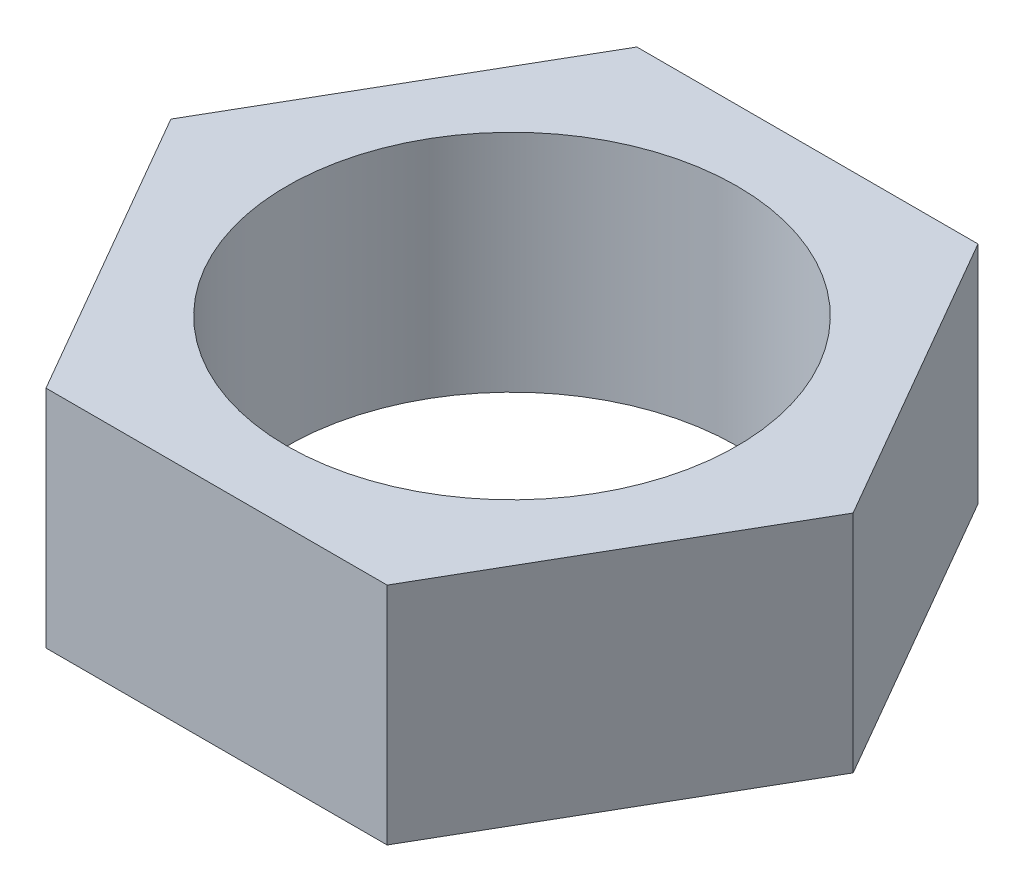
ISO-10303-21;
HEADER;
FILE_DESCRIPTION(('STEP AP214'),'2;1');
FILE_NAME('part.step','',(''),(''),'','','');
FILE_SCHEMA(('AUTOMOTIVE_DESIGN { 1 0 10303 214 1 1 1 1 }'));
ENDSEC;
DATA;
#1=APPLICATION_CONTEXT('core data for automotive mechanical design processes');
#2=APPLICATION_PROTOCOL_DEFINITION('international standard','automotive_design',2000,#1);
#3=PRODUCT_CONTEXT('',#1,'mechanical');
#4=PRODUCT('Part','Part','',(#3));
#5=PRODUCT_RELATED_PRODUCT_CATEGORY('part','',(#4));
#6=PRODUCT_DEFINITION_FORMATION('','',#4);
#7=PRODUCT_DEFINITION_CONTEXT('part definition',#1,'design');
#8=PRODUCT_DEFINITION('design','',#6,#7);
#9=PRODUCT_DEFINITION_SHAPE('','',#8);
#10=(LENGTH_UNIT() NAMED_UNIT(*) SI_UNIT(.MILLI.,.METRE.));
#11=(NAMED_UNIT(*) PLANE_ANGLE_UNIT() SI_UNIT($,.RADIAN.));
#12=(NAMED_UNIT(*) SI_UNIT($,.STERADIAN.) SOLID_ANGLE_UNIT());
#13=UNCERTAINTY_MEASURE_WITH_UNIT(LENGTH_MEASURE(1.E-05),#10,'distance_accuracy_value','');
#14=(GEOMETRIC_REPRESENTATION_CONTEXT(3) GLOBAL_UNCERTAINTY_ASSIGNED_CONTEXT((#13)) GLOBAL_UNIT_ASSIGNED_CONTEXT((#10,
#11,#12)) REPRESENTATION_CONTEXT('',''));
#15=CARTESIAN_POINT('',(0.,0.,0.));
#16=DIRECTION('',(0.,0.,1.));
#17=DIRECTION('',(1.,0.,0.));
#18=AXIS2_PLACEMENT_3D('',#15,#16,#17);
#19=CARTESIAN_POINT('',(0.,12.7,0.));
#20=DIRECTION('',(0.,1.,0.));
#21=DIRECTION('',(0.,0.,1.));
#22=AXIS2_PLACEMENT_3D('',#19,#20,#21);
#23=PLANE('',#22);
#24=DIRECTION('',(0.499999999999995,0.,-0.866025403784442));
#25=VECTOR('',#24,1.);
#26=CARTESIAN_POINT('',(9.62370729955479,12.7,16.6687499999999));
#27=LINE('',#26,#25);
#28=CARTESIAN_POINT('',(9.62370729955479,12.7,16.6687499999999));
#29=VERTEX_POINT('',#28);
#30=CARTESIAN_POINT('',(19.2474145991092,12.7,0.));
#31=VERTEX_POINT('',#30);
#32=EDGE_CURVE('E129',#29,#31,#27,.T.);
#33=ORIENTED_EDGE('',*,*,#32,.T.);
#34=DIRECTION('',(-0.500000000000001,0.,-0.866025403784438));
#35=VECTOR('',#34,1.);
#36=CARTESIAN_POINT('',(19.2474145991092,12.7,0.));
#37=LINE('',#36,#35);
#38=CARTESIAN_POINT('',(9.62370729955456,12.7,-16.6687500000001));
#39=VERTEX_POINT('',#38);
#40=EDGE_CURVE('E87',#31,#39,#37,.T.);
#41=ORIENTED_EDGE('',*,*,#40,.T.);
#42=DIRECTION('',(-1.,0.,0.));
#43=VECTOR('',#42,1.);
#44=CARTESIAN_POINT('',(9.62370729955456,12.7,-16.6687500000001));
#45=LINE('',#44,#43);
#46=CARTESIAN_POINT('',(-9.62370729955468,12.7,-16.66875));
#47=VERTEX_POINT('',#46);
#48=EDGE_CURVE('E100',#39,#47,#45,.T.);
#49=ORIENTED_EDGE('',*,*,#48,.T.);
#50=DIRECTION('',(-0.499999999999995,0.,0.866025403784442));
#51=VECTOR('',#50,1.);
#52=CARTESIAN_POINT('',(-9.62370729955468,12.7,-16.66875));
#53=LINE('',#52,#51);
#54=CARTESIAN_POINT('',(-19.2474145991092,12.7,1.34403977787533E-13));
#55=VERTEX_POINT('',#54);
#56=EDGE_CURVE('E94',#47,#55,#53,.T.);
#57=ORIENTED_EDGE('',*,*,#56,.T.);
#58=DIRECTION('',(0.500000000000007,0.,0.866025403784435));
#59=VECTOR('',#58,1.);
#60=CARTESIAN_POINT('',(-19.2474145991092,12.7,1.34403977787533E-13));
#61=LINE('',#60,#59);
#62=CARTESIAN_POINT('',(-9.62370729955445,12.7,16.6687500000001));
#63=VERTEX_POINT('',#62);
#64=EDGE_CURVE('E98',#55,#63,#61,.T.);
#65=ORIENTED_EDGE('',*,*,#64,.T.);
#66=DIRECTION('',(1.,0.,0.));
#67=VECTOR('',#66,1.);
#68=CARTESIAN_POINT('',(-9.62370729955445,12.7,16.6687500000001));
#69=LINE('',#68,#67);
#70=EDGE_CURVE('E50',#63,#29,#69,.T.);
#71=ORIENTED_EDGE('',*,*,#70,.T.);
#72=EDGE_LOOP('',(#33,#41,#49,#57,#65,#71));
#73=FACE_BOUND('',#72,.T.);
#74=CARTESIAN_POINT('',(0.,12.7,0.));
#75=DIRECTION('',(0.,1.,0.));
#76=DIRECTION('',(0.,0.,1.));
#77=AXIS2_PLACEMENT_3D('',#74,#75,#76);
#78=CIRCLE('',#77,12.7);
#79=CARTESIAN_POINT('',(0.,12.7,12.7));
#80=VERTEX_POINT('',#79);
#81=EDGE_CURVE('E122',#80,#80,#78,.T.);
#82=ORIENTED_EDGE('',*,*,#81,.F.);
#83=EDGE_LOOP('',(#82));
#84=FACE_BOUND('',#83,.T.);
#85=ADVANCED_FACE('F33',(#73,#84),#23,.T.);
#86=CARTESIAN_POINT('',(0.,0.,0.));
#87=DIRECTION('',(0.,1.,0.));
#88=DIRECTION('',(0.,0.,1.));
#89=AXIS2_PLACEMENT_3D('',#86,#87,#88);
#90=PLANE('',#89);
#91=DIRECTION('',(0.499999999999995,0.,-0.866025403784442));
#92=VECTOR('',#91,1.);
#93=CARTESIAN_POINT('',(9.62370729955479,0.,16.6687499999999));
#94=LINE('',#93,#92);
#95=CARTESIAN_POINT('',(9.62370729955479,0.,16.6687499999999));
#96=VERTEX_POINT('',#95);
#97=CARTESIAN_POINT('',(19.2474145991092,0.,0.));
#98=VERTEX_POINT('',#97);
#99=EDGE_CURVE('E118',#96,#98,#94,.T.);
#100=ORIENTED_EDGE('',*,*,#99,.F.);
#101=DIRECTION('',(1.,0.,0.));
#102=VECTOR('',#101,1.);
#103=CARTESIAN_POINT('',(-9.62370729955445,0.,16.6687500000001));
#104=LINE('',#103,#102);
#105=CARTESIAN_POINT('',(-9.62370729955445,0.,16.6687500000001));
#106=VERTEX_POINT('',#105);
#107=EDGE_CURVE('E79',#106,#96,#104,.T.);
#108=ORIENTED_EDGE('',*,*,#107,.F.);
#109=DIRECTION('',(0.500000000000007,0.,0.866025403784435));
#110=VECTOR('',#109,1.);
#111=CARTESIAN_POINT('',(-19.2474145991092,0.,1.34403977787533E-13));
#112=LINE('',#111,#110);
#113=CARTESIAN_POINT('',(-19.2474145991092,0.,1.34403977787533E-13));
#114=VERTEX_POINT('',#113);
#115=EDGE_CURVE('E73',#114,#106,#112,.T.);
#116=ORIENTED_EDGE('',*,*,#115,.F.);
#117=DIRECTION('',(-0.499999999999995,0.,0.866025403784442));
#118=VECTOR('',#117,1.);
#119=CARTESIAN_POINT('',(-9.62370729955468,0.,-16.66875));
#120=LINE('',#119,#118);
#121=CARTESIAN_POINT('',(-9.62370729955468,0.,-16.66875));
#122=VERTEX_POINT('',#121);
#123=EDGE_CURVE('E108',#122,#114,#120,.T.);
#124=ORIENTED_EDGE('',*,*,#123,.F.);
#125=DIRECTION('',(-1.,0.,0.));
#126=VECTOR('',#125,1.);
#127=CARTESIAN_POINT('',(9.62370729955456,0.,-16.6687500000001));
#128=LINE('',#127,#126);
#129=CARTESIAN_POINT('',(9.62370729955456,0.,-16.6687500000001));
#130=VERTEX_POINT('',#129);
#131=EDGE_CURVE('E124',#130,#122,#128,.T.);
#132=ORIENTED_EDGE('',*,*,#131,.F.);
#133=DIRECTION('',(-0.500000000000001,0.,-0.866025403784438));
#134=VECTOR('',#133,1.);
#135=CARTESIAN_POINT('',(19.2474145991092,0.,0.));
#136=LINE('',#135,#134);
#137=EDGE_CURVE('E121',#98,#130,#136,.T.);
#138=ORIENTED_EDGE('',*,*,#137,.F.);
#139=EDGE_LOOP('',(#100,#108,#116,#124,#132,#138));
#140=FACE_BOUND('',#139,.T.);
#141=CARTESIAN_POINT('',(0.,0.,0.));
#142=DIRECTION('',(0.,1.,0.));
#143=DIRECTION('',(0.,0.,1.));
#144=AXIS2_PLACEMENT_3D('',#141,#142,#143);
#145=CIRCLE('',#144,12.7);
#146=CARTESIAN_POINT('',(0.,0.,12.7));
#147=VERTEX_POINT('',#146);
#148=EDGE_CURVE('E222',#147,#147,#145,.T.);
#149=ORIENTED_EDGE('',*,*,#148,.T.);
#150=EDGE_LOOP('',(#149));
#151=FACE_BOUND('',#150,.T.);
#152=ADVANCED_FACE('F138',(#140,#151),#90,.F.);
#153=CARTESIAN_POINT('',(9.62370729955479,12.7,16.6687499999999));
#154=DIRECTION('',(-0.866025403784442,0.,-0.499999999999995));
#155=DIRECTION('',(-0.499999999999995,0.,0.866025403784442));
#156=AXIS2_PLACEMENT_3D('',#153,#154,#155);
#157=PLANE('',#156);
#158=ORIENTED_EDGE('',*,*,#99,.T.);
#159=DIRECTION('',(0.,-1.,0.));
#160=VECTOR('',#159,1.);
#161=CARTESIAN_POINT('',(19.2474145991092,12.7,0.));
#162=LINE('',#161,#160);
#163=EDGE_CURVE('E11',#31,#98,#162,.T.);
#164=ORIENTED_EDGE('',*,*,#163,.F.);
#165=ORIENTED_EDGE('',*,*,#32,.F.);
#166=DIRECTION('',(0.,-1.,0.));
#167=VECTOR('',#166,1.);
#168=CARTESIAN_POINT('',(9.62370729955479,12.7,16.6687499999999));
#169=LINE('',#168,#167);
#170=EDGE_CURVE('E114',#29,#96,#169,.T.);
#171=ORIENTED_EDGE('',*,*,#170,.T.);
#172=EDGE_LOOP('',(#158,#164,#165,#171));
#173=FACE_BOUND('',#172,.T.);
#174=ADVANCED_FACE('F35',(#173),#157,.F.);
#175=CARTESIAN_POINT('',(19.2474145991092,12.7,0.));
#176=DIRECTION('',(-0.866025403784438,0.,0.500000000000001));
#177=DIRECTION('',(0.500000000000001,0.,0.866025403784438));
#178=AXIS2_PLACEMENT_3D('',#175,#176,#177);
#179=PLANE('',#178);
#180=ORIENTED_EDGE('',*,*,#137,.T.);
#181=DIRECTION('',(0.,-1.,0.));
#182=VECTOR('',#181,1.);
#183=CARTESIAN_POINT('',(9.62370729955456,12.7,-16.6687500000001));
#184=LINE('',#183,#182);
#185=EDGE_CURVE('E42',#39,#130,#184,.T.);
#186=ORIENTED_EDGE('',*,*,#185,.F.);
#187=ORIENTED_EDGE('',*,*,#40,.F.);
#188=ORIENTED_EDGE('',*,*,#163,.T.);
#189=EDGE_LOOP('',(#180,#186,#187,#188));
#190=FACE_BOUND('',#189,.T.);
#191=ADVANCED_FACE('F163',(#190),#179,.F.);
#192=CARTESIAN_POINT('',(9.62370729955456,12.7,-16.6687500000001));
#193=DIRECTION('',(0.,0.,1.));
#194=DIRECTION('',(1.,0.,0.));
#195=AXIS2_PLACEMENT_3D('',#192,#193,#194);
#196=PLANE('',#195);
#197=ORIENTED_EDGE('',*,*,#131,.T.);
#198=DIRECTION('',(0.,-1.,0.));
#199=VECTOR('',#198,1.);
#200=CARTESIAN_POINT('',(-9.62370729955468,12.7,-16.66875));
#201=LINE('',#200,#199);
#202=EDGE_CURVE('E109',#47,#122,#201,.T.);
#203=ORIENTED_EDGE('',*,*,#202,.F.);
#204=ORIENTED_EDGE('',*,*,#48,.F.);
#205=ORIENTED_EDGE('',*,*,#185,.T.);
#206=EDGE_LOOP('',(#197,#203,#204,#205));
#207=FACE_BOUND('',#206,.T.);
#208=ADVANCED_FACE('F135',(#207),#196,.F.);
#209=CARTESIAN_POINT('',(-9.62370729955468,12.7,-16.66875));
#210=DIRECTION('',(0.866025403784442,0.,0.499999999999995));
#211=DIRECTION('',(0.499999999999995,0.,-0.866025403784442));
#212=AXIS2_PLACEMENT_3D('',#209,#210,#211);
#213=PLANE('',#212);
#214=ORIENTED_EDGE('',*,*,#123,.T.);
#215=DIRECTION('',(0.,-1.,0.));
#216=VECTOR('',#215,1.);
#217=CARTESIAN_POINT('',(-19.2474145991092,12.7,1.34403977787533E-13));
#218=LINE('',#217,#216);
#219=EDGE_CURVE('E105',#55,#114,#218,.T.);
#220=ORIENTED_EDGE('',*,*,#219,.F.);
#221=ORIENTED_EDGE('',*,*,#56,.F.);
#222=ORIENTED_EDGE('',*,*,#202,.T.);
#223=EDGE_LOOP('',(#214,#220,#221,#222));
#224=FACE_BOUND('',#223,.T.);
#225=ADVANCED_FACE('F106',(#224),#213,.F.);
#226=CARTESIAN_POINT('',(-19.2474145991092,12.7,1.34403977787533E-13));
#227=DIRECTION('',(0.866025403784435,0.,-0.500000000000007));
#228=DIRECTION('',(-0.500000000000007,0.,-0.866025403784435));
#229=AXIS2_PLACEMENT_3D('',#226,#227,#228);
#230=PLANE('',#229);
#231=ORIENTED_EDGE('',*,*,#115,.T.);
#232=DIRECTION('',(0.,-1.,0.));
#233=VECTOR('',#232,1.);
#234=CARTESIAN_POINT('',(-9.62370729955445,12.7,16.6687500000001));
#235=LINE('',#234,#233);
#236=EDGE_CURVE('E110',#63,#106,#235,.T.);
#237=ORIENTED_EDGE('',*,*,#236,.F.);
#238=ORIENTED_EDGE('',*,*,#64,.F.);
#239=ORIENTED_EDGE('',*,*,#219,.T.);
#240=EDGE_LOOP('',(#231,#237,#238,#239));
#241=FACE_BOUND('',#240,.T.);
#242=ADVANCED_FACE('F112',(#241),#230,.F.);
#243=CARTESIAN_POINT('',(-9.62370729955445,12.7,16.6687500000001));
#244=DIRECTION('',(0.,0.,-1.));
#245=DIRECTION('',(-1.,0.,0.));
#246=AXIS2_PLACEMENT_3D('',#243,#244,#245);
#247=PLANE('',#246);
#248=ORIENTED_EDGE('',*,*,#107,.T.);
#249=ORIENTED_EDGE('',*,*,#170,.F.);
#250=ORIENTED_EDGE('',*,*,#70,.F.);
#251=ORIENTED_EDGE('',*,*,#236,.T.);
#252=EDGE_LOOP('',(#248,#249,#250,#251));
#253=FACE_BOUND('',#252,.T.);
#254=ADVANCED_FACE('F143',(#253),#247,.F.);
#255=CARTESIAN_POINT('',(0.,12.7,0.));
#256=DIRECTION('',(0.,-1.,0.));
#257=DIRECTION('',(0.,0.,-1.));
#258=AXIS2_PLACEMENT_3D('',#255,#256,#257);
#259=CYLINDRICAL_SURFACE('',#258,12.7);
#260=ORIENTED_EDGE('',*,*,#81,.T.);
#261=EDGE_LOOP('',(#260));
#262=FACE_BOUND('',#261,.T.);
#263=ORIENTED_EDGE('',*,*,#148,.F.);
#264=EDGE_LOOP('',(#263));
#265=FACE_BOUND('',#264,.T.);
#266=ADVANCED_FACE('F145',(#262,#265),#259,.F.);
#267=CLOSED_SHELL('',(#85,#152,#174,#191,#208,#225,#242,#254,#266));
#268=MANIFOLD_SOLID_BREP('B2',#267);
#269=ADVANCED_BREP_SHAPE_REPRESENTATION('',(#18,#268),#14);
#270=SHAPE_DEFINITION_REPRESENTATION(#9,#269);
ENDSEC;
END-ISO-10303-21;
